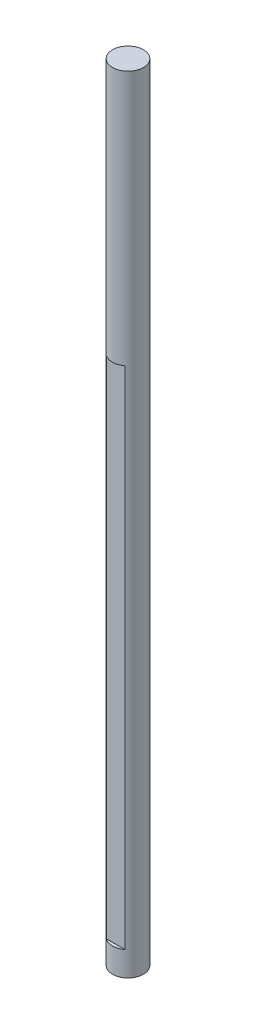
ISO-10303-21;
HEADER;
FILE_DESCRIPTION(('STEP AP214'),'2;1');
FILE_NAME('part.step','',(''),(''),'','','');
FILE_SCHEMA(('AUTOMOTIVE_DESIGN { 1 0 10303 214 1 1 1 1 }'));
ENDSEC;
DATA;
#1=APPLICATION_CONTEXT('core data for automotive mechanical design processes');
#2=APPLICATION_PROTOCOL_DEFINITION('international standard','automotive_design',2000,#1);
#3=PRODUCT_CONTEXT('',#1,'mechanical');
#4=PRODUCT('Part','Part','',(#3));
#5=PRODUCT_RELATED_PRODUCT_CATEGORY('part','',(#4));
#6=PRODUCT_DEFINITION_FORMATION('','',#4);
#7=PRODUCT_DEFINITION_CONTEXT('part definition',#1,'design');
#8=PRODUCT_DEFINITION('design','',#6,#7);
#9=PRODUCT_DEFINITION_SHAPE('','',#8);
#10=(LENGTH_UNIT() NAMED_UNIT(*) SI_UNIT(.MILLI.,.METRE.));
#11=(NAMED_UNIT(*) PLANE_ANGLE_UNIT() SI_UNIT($,.RADIAN.));
#12=(NAMED_UNIT(*) SI_UNIT($,.STERADIAN.) SOLID_ANGLE_UNIT());
#13=UNCERTAINTY_MEASURE_WITH_UNIT(LENGTH_MEASURE(1.E-05),#10,'distance_accuracy_value','');
#14=(GEOMETRIC_REPRESENTATION_CONTEXT(3) GLOBAL_UNCERTAINTY_ASSIGNED_CONTEXT((#13)) GLOBAL_UNIT_ASSIGNED_CONTEXT((#10,
#11,#12)) REPRESENTATION_CONTEXT('',''));
#15=CARTESIAN_POINT('',(0.,0.,0.));
#16=DIRECTION('',(0.,0.,1.));
#17=DIRECTION('',(1.,0.,0.));
#18=AXIS2_PLACEMENT_3D('',#15,#16,#17);
#19=CARTESIAN_POINT('',(0.,203.2,0.));
#20=DIRECTION('',(0.,-1.,0.));
#21=DIRECTION('',(0.,0.,-1.));
#22=AXIS2_PLACEMENT_3D('',#19,#20,#21);
#23=CYLINDRICAL_SURFACE('',#22,4.);
#24=CARTESIAN_POINT('',(0.,0.,0.));
#25=DIRECTION('',(0.,1.,0.));
#26=DIRECTION('',(0.,0.,1.));
#27=AXIS2_PLACEMENT_3D('',#24,#25,#26);
#28=CIRCLE('',#27,4.);
#29=CARTESIAN_POINT('',(0.,0.,4.));
#30=VERTEX_POINT('',#29);
#31=EDGE_CURVE('E36',#30,#30,#28,.T.);
#32=ORIENTED_EDGE('',*,*,#31,.T.);
#33=EDGE_LOOP('',(#32));
#34=FACE_BOUND('',#33,.T.);
#35=CARTESIAN_POINT('',(0.,203.2,0.));
#36=DIRECTION('',(0.,1.,0.));
#37=DIRECTION('',(0.,0.,1.));
#38=AXIS2_PLACEMENT_3D('',#35,#36,#37);
#39=CIRCLE('',#38,4.);
#40=CARTESIAN_POINT('',(0.,203.2,4.));
#41=VERTEX_POINT('',#40);
#42=EDGE_CURVE('E11',#41,#41,#39,.T.);
#43=ORIENTED_EDGE('',*,*,#42,.F.);
#44=EDGE_LOOP('',(#43));
#45=FACE_BOUND('',#44,.T.);
#46=CARTESIAN_POINT('',(0.,137.16,0.));
#47=DIRECTION('',(0.,-1.,0.));
#48=DIRECTION('',(0.,0.,-1.));
#49=AXIS2_PLACEMENT_3D('',#46,#47,#48);
#50=CIRCLE('',#49,4.);
#51=CARTESIAN_POINT('',(2.42098982388947,137.16,3.18414953678743));
#52=VERTEX_POINT('',#51);
#53=CARTESIAN_POINT('',(-2.42098982388947,137.16,3.18414953678743));
#54=VERTEX_POINT('',#53);
#55=EDGE_CURVE('E67',#52,#54,#50,.T.);
#56=ORIENTED_EDGE('',*,*,#55,.F.);
#57=DIRECTION('',(0.,-1.,0.));
#58=VECTOR('',#57,1.);
#59=CARTESIAN_POINT('',(2.42098982388947,137.16,3.18414953678743));
#60=LINE('',#59,#58);
#61=CARTESIAN_POINT('',(2.42098982388947,6.35,3.18414953678743));
#62=VERTEX_POINT('',#61);
#63=EDGE_CURVE('E54',#52,#62,#60,.T.);
#64=ORIENTED_EDGE('',*,*,#63,.T.);
#65=CARTESIAN_POINT('',(0.,6.35,0.));
#66=DIRECTION('',(0.,-1.,0.));
#67=DIRECTION('',(0.,0.,-1.));
#68=AXIS2_PLACEMENT_3D('',#65,#66,#67);
#69=CIRCLE('',#68,4.);
#70=CARTESIAN_POINT('',(-2.42098982388947,6.34999999999999,3.18414953678743));
#71=VERTEX_POINT('',#70);
#72=EDGE_CURVE('E60',#62,#71,#69,.T.);
#73=ORIENTED_EDGE('',*,*,#72,.T.);
#74=DIRECTION('',(0.,-1.,0.));
#75=VECTOR('',#74,1.);
#76=CARTESIAN_POINT('',(-2.42098982388947,137.16,3.18414953678743));
#77=LINE('',#76,#75);
#78=EDGE_CURVE('E66',#54,#71,#77,.T.);
#79=ORIENTED_EDGE('',*,*,#78,.F.);
#80=EDGE_LOOP('',(#56,#64,#73,#79));
#81=FACE_BOUND('',#80,.T.);
#82=ADVANCED_FACE('F33',(#34,#45,#81),#23,.T.);
#83=CARTESIAN_POINT('',(0.,203.2,0.));
#84=DIRECTION('',(0.,1.,0.));
#85=DIRECTION('',(0.,0.,1.));
#86=AXIS2_PLACEMENT_3D('',#83,#84,#85);
#87=PLANE('',#86);
#88=ORIENTED_EDGE('',*,*,#42,.T.);
#89=EDGE_LOOP('',(#88));
#90=FACE_BOUND('',#89,.T.);
#91=ADVANCED_FACE('F89',(#90),#87,.T.);
#92=CARTESIAN_POINT('',(0.,0.,0.));
#93=DIRECTION('',(0.,1.,0.));
#94=DIRECTION('',(0.,0.,1.));
#95=AXIS2_PLACEMENT_3D('',#92,#93,#94);
#96=PLANE('',#95);
#97=CARTESIAN_POINT('',(0.,0.,0.));
#98=DIRECTION('',(0.,-1.,0.));
#99=DIRECTION('',(0.,0.,-1.));
#100=AXIS2_PLACEMENT_3D('',#97,#98,#99);
#101=CIRCLE('',#100,1.86495053778096);
#102=CARTESIAN_POINT('',(0.,0.,-1.86495053778096));
#103=VERTEX_POINT('',#102);
#104=EDGE_CURVE('E70',#103,#103,#101,.T.);
#105=ORIENTED_EDGE('',*,*,#104,.F.);
#106=EDGE_LOOP('',(#105));
#107=FACE_BOUND('',#106,.T.);
#108=ORIENTED_EDGE('',*,*,#31,.F.);
#109=EDGE_LOOP('',(#108));
#110=FACE_BOUND('',#109,.T.);
#111=ADVANCED_FACE('F86',(#107,#110),#96,.F.);
#112=CARTESIAN_POINT('',(0.,12.7,0.));
#113=DIRECTION('',(0.,-1.,0.));
#114=DIRECTION('',(0.,0.,-1.));
#115=AXIS2_PLACEMENT_3D('',#112,#113,#114);
#116=CYLINDRICAL_SURFACE('',#115,1.86495053778096);
#117=CARTESIAN_POINT('',(0.,12.7,0.));
#118=DIRECTION('',(0.,-1.,0.));
#119=DIRECTION('',(0.,0.,-1.));
#120=AXIS2_PLACEMENT_3D('',#117,#118,#119);
#121=CIRCLE('',#120,1.86495053778096);
#122=CARTESIAN_POINT('',(0.,12.7,-1.86495053778096));
#123=VERTEX_POINT('',#122);
#124=EDGE_CURVE('E73',#123,#123,#121,.T.);
#125=ORIENTED_EDGE('',*,*,#124,.F.);
#126=EDGE_LOOP('',(#125));
#127=FACE_BOUND('',#126,.T.);
#128=ORIENTED_EDGE('',*,*,#104,.T.);
#129=EDGE_LOOP('',(#128));
#130=FACE_BOUND('',#129,.T.);
#131=ADVANCED_FACE('F88',(#127,#130),#116,.F.);
#132=CARTESIAN_POINT('',(0.,12.7,0.));
#133=DIRECTION('',(0.,-1.,0.));
#134=DIRECTION('',(0.,0.,-1.));
#135=AXIS2_PLACEMENT_3D('',#132,#133,#134);
#136=PLANE('',#135);
#137=ORIENTED_EDGE('',*,*,#124,.T.);
#138=EDGE_LOOP('',(#137));
#139=FACE_BOUND('',#138,.T.);
#140=ADVANCED_FACE('F95',(#139),#136,.T.);
#141=CARTESIAN_POINT('',(0.,137.16,3.18414953678743));
#142=DIRECTION('',(0.,0.,-1.));
#143=DIRECTION('',(-1.,0.,0.));
#144=AXIS2_PLACEMENT_3D('',#141,#142,#143);
#145=PLANE('',#144);
#146=DIRECTION('',(1.,0.,0.));
#147=VECTOR('',#146,1.);
#148=CARTESIAN_POINT('',(0.,6.35,3.18414953678743));
#149=LINE('',#148,#147);
#150=EDGE_CURVE('E46',#71,#62,#149,.T.);
#151=ORIENTED_EDGE('',*,*,#150,.T.);
#152=ORIENTED_EDGE('',*,*,#63,.F.);
#153=DIRECTION('',(1.,0.,0.));
#154=VECTOR('',#153,1.);
#155=CARTESIAN_POINT('',(0.,137.16,3.18414953678743));
#156=LINE('',#155,#154);
#157=EDGE_CURVE('E75',#54,#52,#156,.T.);
#158=ORIENTED_EDGE('',*,*,#157,.F.);
#159=ORIENTED_EDGE('',*,*,#78,.T.);
#160=EDGE_LOOP('',(#151,#152,#158,#159));
#161=FACE_BOUND('',#160,.T.);
#162=ADVANCED_FACE('F65',(#161),#145,.F.);
#163=CARTESIAN_POINT('',(0.,137.16,0.));
#164=DIRECTION('',(0.,-1.,0.));
#165=DIRECTION('',(0.,0.,-1.));
#166=AXIS2_PLACEMENT_3D('',#163,#164,#165);
#167=PLANE('',#166);
#168=ORIENTED_EDGE('',*,*,#55,.T.);
#169=ORIENTED_EDGE('',*,*,#157,.T.);
#170=EDGE_LOOP('',(#168,#169));
#171=FACE_BOUND('',#170,.T.);
#172=ADVANCED_FACE('F134',(#171),#167,.T.);
#173=CARTESIAN_POINT('',(0.,6.35,0.));
#174=DIRECTION('',(0.,-1.,0.));
#175=DIRECTION('',(0.,0.,-1.));
#176=AXIS2_PLACEMENT_3D('',#173,#174,#175);
#177=PLANE('',#176);
#178=ORIENTED_EDGE('',*,*,#72,.F.);
#179=ORIENTED_EDGE('',*,*,#150,.F.);
#180=EDGE_LOOP('',(#178,#179));
#181=FACE_BOUND('',#180,.T.);
#182=ADVANCED_FACE('F61',(#181),#177,.F.);
#183=CLOSED_SHELL('',(#82,#91,#111,#131,#140,#162,#172,#182));
#184=MANIFOLD_SOLID_BREP('B2',#183);
#185=ADVANCED_BREP_SHAPE_REPRESENTATION('',(#18,#184),#14);
#186=SHAPE_DEFINITION_REPRESENTATION(#9,#185);
ENDSEC;
END-ISO-10303-21;
